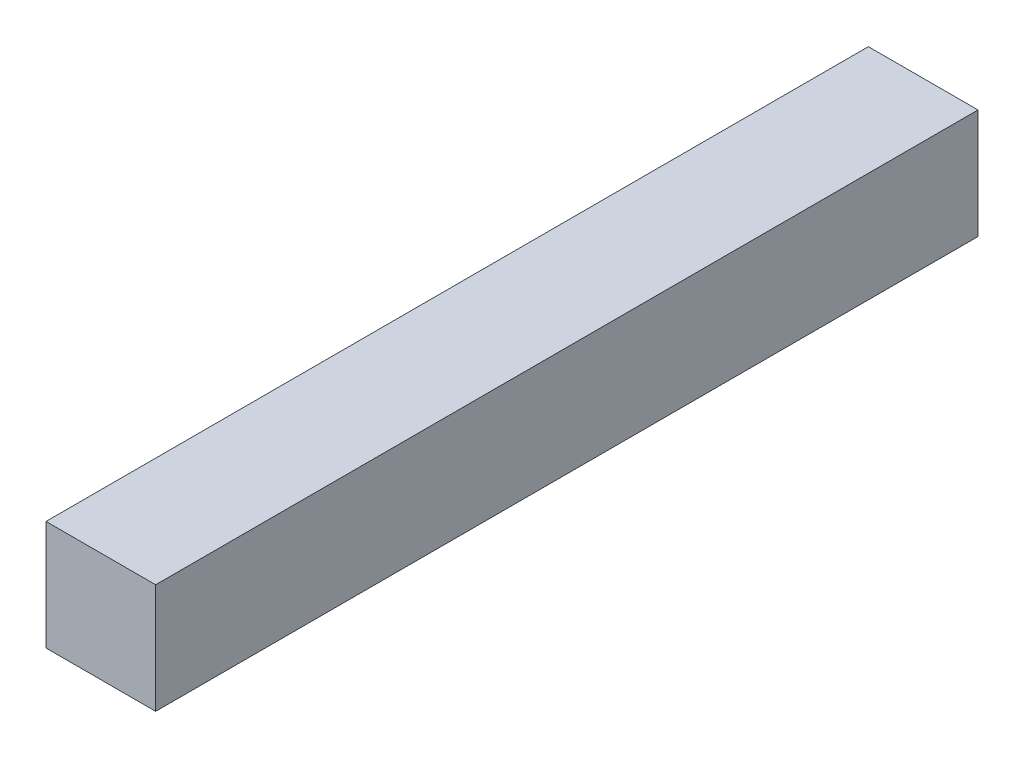
ISO-10303-21;
HEADER;
FILE_DESCRIPTION(('STEP AP214'),'2;1');
FILE_NAME('part.step','',(''),(''),'','','');
FILE_SCHEMA(('AUTOMOTIVE_DESIGN { 1 0 10303 214 1 1 1 1 }'));
ENDSEC;
DATA;
#1=APPLICATION_CONTEXT('core data for automotive mechanical design processes');
#2=APPLICATION_PROTOCOL_DEFINITION('international standard','automotive_design',2000,#1);
#3=PRODUCT_CONTEXT('',#1,'mechanical');
#4=PRODUCT('Part','Part','',(#3));
#5=PRODUCT_RELATED_PRODUCT_CATEGORY('part','',(#4));
#6=PRODUCT_DEFINITION_FORMATION('','',#4);
#7=PRODUCT_DEFINITION_CONTEXT('part definition',#1,'design');
#8=PRODUCT_DEFINITION('design','',#6,#7);
#9=PRODUCT_DEFINITION_SHAPE('','',#8);
#10=(LENGTH_UNIT() NAMED_UNIT(*) SI_UNIT(.MILLI.,.METRE.));
#11=(NAMED_UNIT(*) PLANE_ANGLE_UNIT() SI_UNIT($,.RADIAN.));
#12=(NAMED_UNIT(*) SI_UNIT($,.STERADIAN.) SOLID_ANGLE_UNIT());
#13=UNCERTAINTY_MEASURE_WITH_UNIT(LENGTH_MEASURE(1.E-05),#10,'distance_accuracy_value','');
#14=(GEOMETRIC_REPRESENTATION_CONTEXT(3) GLOBAL_UNCERTAINTY_ASSIGNED_CONTEXT((#13)) GLOBAL_UNIT_ASSIGNED_CONTEXT((#10,
#11,#12)) REPRESENTATION_CONTEXT('',''));
#15=CARTESIAN_POINT('',(0.,0.,0.));
#16=DIRECTION('',(0.,0.,1.));
#17=DIRECTION('',(1.,0.,0.));
#18=AXIS2_PLACEMENT_3D('',#15,#16,#17);
#19=CARTESIAN_POINT('',(-1.27,0.,-3.75));
#20=DIRECTION('',(0.,0.,1.));
#21=DIRECTION('',(1.,0.,0.));
#22=AXIS2_PLACEMENT_3D('',#19,#20,#21);
#23=PLANE('',#22);
#24=DIRECTION('',(0.,-1.,0.));
#25=VECTOR('',#24,1.);
#26=CARTESIAN_POINT('',(-1.52,0.25,-3.75));
#27=LINE('',#26,#25);
#28=CARTESIAN_POINT('',(-1.52,0.25,-3.75));
#29=VERTEX_POINT('',#28);
#30=CARTESIAN_POINT('',(-1.52,-0.25,-3.75));
#31=VERTEX_POINT('',#30);
#32=EDGE_CURVE('E27',#29,#31,#27,.T.);
#33=ORIENTED_EDGE('',*,*,#32,.F.);
#34=DIRECTION('',(-1.,0.,0.));
#35=VECTOR('',#34,1.);
#36=CARTESIAN_POINT('',(-1.02,0.25,-3.75));
#37=LINE('',#36,#35);
#38=CARTESIAN_POINT('',(-1.02,0.25,-3.75));
#39=VERTEX_POINT('',#38);
#40=EDGE_CURVE('E71',#39,#29,#37,.T.);
#41=ORIENTED_EDGE('',*,*,#40,.F.);
#42=DIRECTION('',(0.,1.,0.));
#43=VECTOR('',#42,1.);
#44=CARTESIAN_POINT('',(-1.02,-0.25,-3.75));
#45=LINE('',#44,#43);
#46=CARTESIAN_POINT('',(-1.02,-0.25,-3.75));
#47=VERTEX_POINT('',#46);
#48=EDGE_CURVE('E91',#47,#39,#45,.T.);
#49=ORIENTED_EDGE('',*,*,#48,.F.);
#50=DIRECTION('',(1.,0.,0.));
#51=VECTOR('',#50,1.);
#52=CARTESIAN_POINT('',(-1.52,-0.25,-3.75));
#53=LINE('',#52,#51);
#54=EDGE_CURVE('E109',#31,#47,#53,.T.);
#55=ORIENTED_EDGE('',*,*,#54,.F.);
#56=EDGE_LOOP('',(#33,#41,#49,#55));
#57=FACE_BOUND('',#56,.T.);
#58=ADVANCED_FACE('F16',(#57),#23,.F.);
#59=CARTESIAN_POINT('',(-1.27,0.,0.));
#60=DIRECTION('',(0.,0.,1.));
#61=DIRECTION('',(1.,0.,0.));
#62=AXIS2_PLACEMENT_3D('',#59,#60,#61);
#63=PLANE('',#62);
#64=DIRECTION('',(1.,0.,0.));
#65=VECTOR('',#64,1.);
#66=CARTESIAN_POINT('',(-1.52,-0.25,0.));
#67=LINE('',#66,#65);
#68=CARTESIAN_POINT('',(-1.52,-0.25,0.));
#69=VERTEX_POINT('',#68);
#70=CARTESIAN_POINT('',(-1.02,-0.25,0.));
#71=VERTEX_POINT('',#70);
#72=EDGE_CURVE('E87',#69,#71,#67,.T.);
#73=ORIENTED_EDGE('',*,*,#72,.T.);
#74=DIRECTION('',(0.,1.,0.));
#75=VECTOR('',#74,1.);
#76=CARTESIAN_POINT('',(-1.02,-0.25,0.));
#77=LINE('',#76,#75);
#78=CARTESIAN_POINT('',(-1.02,0.25,0.));
#79=VERTEX_POINT('',#78);
#80=EDGE_CURVE('E20',#71,#79,#77,.T.);
#81=ORIENTED_EDGE('',*,*,#80,.T.);
#82=DIRECTION('',(-1.,0.,0.));
#83=VECTOR('',#82,1.);
#84=CARTESIAN_POINT('',(-1.02,0.25,0.));
#85=LINE('',#84,#83);
#86=CARTESIAN_POINT('',(-1.52,0.25,0.));
#87=VERTEX_POINT('',#86);
#88=EDGE_CURVE('E78',#79,#87,#85,.T.);
#89=ORIENTED_EDGE('',*,*,#88,.T.);
#90=DIRECTION('',(0.,-1.,0.));
#91=VECTOR('',#90,1.);
#92=CARTESIAN_POINT('',(-1.52,0.25,0.));
#93=LINE('',#92,#91);
#94=EDGE_CURVE('E11',#87,#69,#93,.T.);
#95=ORIENTED_EDGE('',*,*,#94,.T.);
#96=EDGE_LOOP('',(#73,#81,#89,#95));
#97=FACE_BOUND('',#96,.T.);
#98=ADVANCED_FACE('F85',(#97),#63,.T.);
#99=CARTESIAN_POINT('',(-1.52,0.25,0.));
#100=DIRECTION('',(-1.,0.,0.));
#101=DIRECTION('',(0.,0.,1.));
#102=AXIS2_PLACEMENT_3D('',#99,#100,#101);
#103=PLANE('',#102);
#104=DIRECTION('',(0.,0.,-1.));
#105=VECTOR('',#104,1.);
#106=CARTESIAN_POINT('',(-1.52,0.25,0.));
#107=LINE('',#106,#105);
#108=EDGE_CURVE('E82',#87,#29,#107,.T.);
#109=ORIENTED_EDGE('',*,*,#108,.T.);
#110=ORIENTED_EDGE('',*,*,#32,.T.);
#111=DIRECTION('',(0.,0.,-1.));
#112=VECTOR('',#111,1.);
#113=CARTESIAN_POINT('',(-1.52,-0.25,0.));
#114=LINE('',#113,#112);
#115=EDGE_CURVE('E112',#69,#31,#114,.T.);
#116=ORIENTED_EDGE('',*,*,#115,.F.);
#117=ORIENTED_EDGE('',*,*,#94,.F.);
#118=EDGE_LOOP('',(#109,#110,#116,#117));
#119=FACE_BOUND('',#118,.T.);
#120=ADVANCED_FACE('F18',(#119),#103,.T.);
#121=CARTESIAN_POINT('',(-1.02,0.25,0.));
#122=DIRECTION('',(0.,1.,0.));
#123=DIRECTION('',(1.,0.,0.));
#124=AXIS2_PLACEMENT_3D('',#121,#122,#123);
#125=PLANE('',#124);
#126=DIRECTION('',(0.,0.,-1.));
#127=VECTOR('',#126,1.);
#128=CARTESIAN_POINT('',(-1.02,0.25,0.));
#129=LINE('',#128,#127);
#130=EDGE_CURVE('E80',#79,#39,#129,.T.);
#131=ORIENTED_EDGE('',*,*,#130,.T.);
#132=ORIENTED_EDGE('',*,*,#40,.T.);
#133=ORIENTED_EDGE('',*,*,#108,.F.);
#134=ORIENTED_EDGE('',*,*,#88,.F.);
#135=EDGE_LOOP('',(#131,#132,#133,#134));
#136=FACE_BOUND('',#135,.T.);
#137=ADVANCED_FACE('F79',(#136),#125,.T.);
#138=CARTESIAN_POINT('',(-1.02,-0.25,0.));
#139=DIRECTION('',(1.,0.,0.));
#140=DIRECTION('',(0.,1.,0.));
#141=AXIS2_PLACEMENT_3D('',#138,#139,#140);
#142=PLANE('',#141);
#143=DIRECTION('',(0.,0.,-1.));
#144=VECTOR('',#143,1.);
#145=CARTESIAN_POINT('',(-1.02,-0.25,0.));
#146=LINE('',#145,#144);
#147=EDGE_CURVE('E108',#71,#47,#146,.T.);
#148=ORIENTED_EDGE('',*,*,#147,.T.);
#149=ORIENTED_EDGE('',*,*,#48,.T.);
#150=ORIENTED_EDGE('',*,*,#130,.F.);
#151=ORIENTED_EDGE('',*,*,#80,.F.);
#152=EDGE_LOOP('',(#148,#149,#150,#151));
#153=FACE_BOUND('',#152,.T.);
#154=ADVANCED_FACE('F90',(#153),#142,.T.);
#155=CARTESIAN_POINT('',(-1.52,-0.25,0.));
#156=DIRECTION('',(0.,-1.,0.));
#157=DIRECTION('',(0.,0.,-1.));
#158=AXIS2_PLACEMENT_3D('',#155,#156,#157);
#159=PLANE('',#158);
#160=ORIENTED_EDGE('',*,*,#115,.T.);
#161=ORIENTED_EDGE('',*,*,#54,.T.);
#162=ORIENTED_EDGE('',*,*,#147,.F.);
#163=ORIENTED_EDGE('',*,*,#72,.F.);
#164=EDGE_LOOP('',(#160,#161,#162,#163));
#165=FACE_BOUND('',#164,.T.);
#166=ADVANCED_FACE('F119',(#165),#159,.T.);
#167=CLOSED_SHELL('',(#58,#98,#120,#137,#154,#166));
#168=MANIFOLD_SOLID_BREP('B1',#167);
#169=ADVANCED_BREP_SHAPE_REPRESENTATION('',(#18,#168),#14);
#170=SHAPE_DEFINITION_REPRESENTATION(#9,#169);
ENDSEC;
END-ISO-10303-21;
